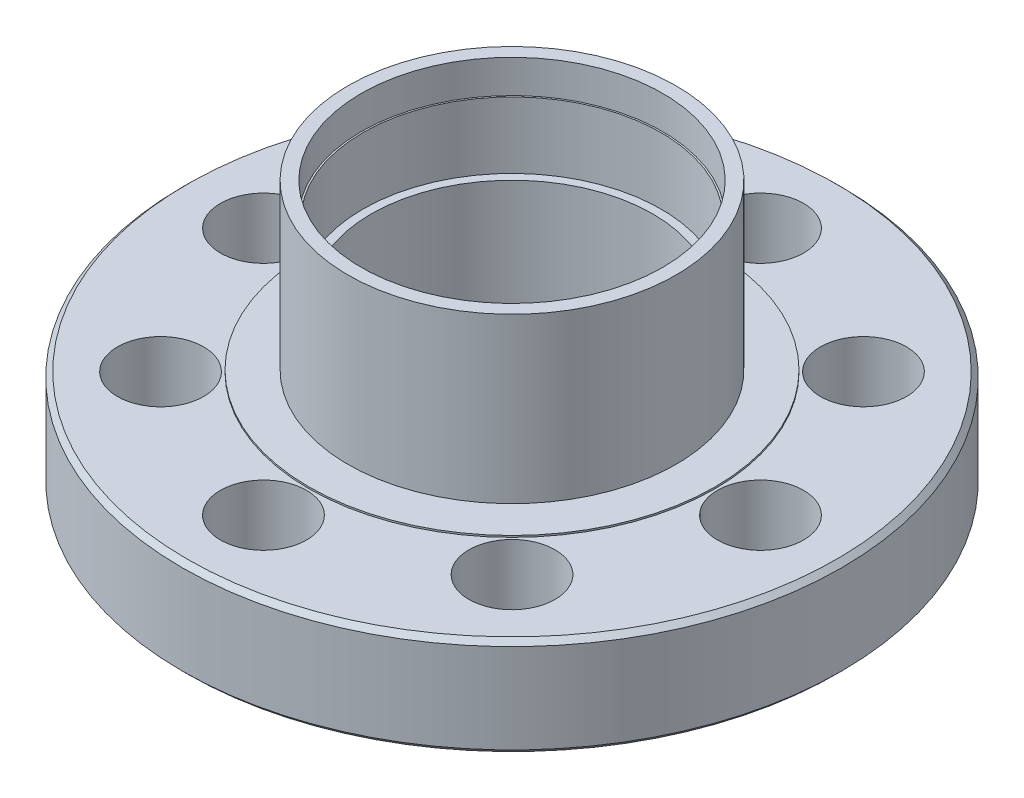
ISO-10303-21;
HEADER;
FILE_DESCRIPTION(('STEP AP214'),'2;1');
FILE_NAME('part.step','',(''),(''),'','','');
FILE_SCHEMA(('AUTOMOTIVE_DESIGN { 1 0 10303 214 1 1 1 1 }'));
ENDSEC;
DATA;
#1=APPLICATION_CONTEXT('core data for automotive mechanical design processes');
#2=APPLICATION_PROTOCOL_DEFINITION('international standard','automotive_design',2000,#1);
#3=PRODUCT_CONTEXT('',#1,'mechanical');
#4=PRODUCT('Part','Part','',(#3));
#5=PRODUCT_RELATED_PRODUCT_CATEGORY('part','',(#4));
#6=PRODUCT_DEFINITION_FORMATION('','',#4);
#7=PRODUCT_DEFINITION_CONTEXT('part definition',#1,'design');
#8=PRODUCT_DEFINITION('design','',#6,#7);
#9=PRODUCT_DEFINITION_SHAPE('','',#8);
#10=(LENGTH_UNIT() NAMED_UNIT(*) SI_UNIT(.MILLI.,.METRE.));
#11=(NAMED_UNIT(*) PLANE_ANGLE_UNIT() SI_UNIT($,.RADIAN.));
#12=(NAMED_UNIT(*) SI_UNIT($,.STERADIAN.) SOLID_ANGLE_UNIT());
#13=UNCERTAINTY_MEASURE_WITH_UNIT(LENGTH_MEASURE(1.E-05),#10,'distance_accuracy_value','');
#14=(GEOMETRIC_REPRESENTATION_CONTEXT(3) GLOBAL_UNCERTAINTY_ASSIGNED_CONTEXT((#13)) GLOBAL_UNIT_ASSIGNED_CONTEXT((#10,
#11,#12)) REPRESENTATION_CONTEXT('',''));
#15=CARTESIAN_POINT('',(0.,0.,0.));
#16=DIRECTION('',(0.,0.,1.));
#17=DIRECTION('',(1.,0.,0.));
#18=AXIS2_PLACEMENT_3D('',#15,#16,#17);
#19=CARTESIAN_POINT('',(0.,0.1499999999606,-1.294671798367E-13));
#20=DIRECTION('',(0.,1.,0.));
#21=DIRECTION('',(0.,0.,-1.));
#22=AXIS2_PLACEMENT_3D('',#19,#20,#21);
#23=CONICAL_SURFACE('',#22,19.74999999996,0.785398163397448);
#24=CARTESIAN_POINT('',(0.,0.3,0.));
#25=DIRECTION('',(0.,1.,0.));
#26=DIRECTION('',(-1.,0.,0.));
#27=AXIS2_PLACEMENT_3D('',#24,#25,#26);
#28=CIRCLE('',#27,19.9);
#29=CARTESIAN_POINT('',(0.,0.300000000000364,19.8999999999996));
#30=VERTEX_POINT('',#29);
#31=CARTESIAN_POINT('',(-19.9,0.3,0.));
#32=VERTEX_POINT('',#31);
#33=EDGE_CURVE('E28',#30,#32,#28,.T.);
#34=ORIENTED_EDGE('',*,*,#33,.F.);
#35=DIRECTION('',(0.,-0.707106781186548,-0.707106781186548));
#36=VECTOR('',#35,1.);
#37=CARTESIAN_POINT('',(0.,0.1499999999606,19.7499999999599));
#38=LINE('',#37,#36);
#39=CARTESIAN_POINT('',(0.,3.04201108747293E-13,19.5999999999996));
#40=VERTEX_POINT('',#39);
#41=EDGE_CURVE('E11',#30,#40,#38,.T.);
#42=ORIENTED_EDGE('',*,*,#41,.T.);
#43=CARTESIAN_POINT('',(0.,0.,-1.294671798367E-13));
#44=DIRECTION('',(0.,1.,0.));
#45=DIRECTION('',(1.,0.,0.));
#46=AXIS2_PLACEMENT_3D('',#43,#44,#45);
#47=CIRCLE('',#46,19.6);
#48=EDGE_CURVE('E160',#40,#40,#47,.T.);
#49=ORIENTED_EDGE('',*,*,#48,.T.);
#50=ORIENTED_EDGE('',*,*,#41,.F.);
#51=CARTESIAN_POINT('',(0.,0.3,0.));
#52=DIRECTION('',(0.,1.,0.));
#53=DIRECTION('',(-1.,0.,0.));
#54=AXIS2_PLACEMENT_3D('',#51,#52,#53);
#55=CIRCLE('',#54,19.9);
#56=EDGE_CURVE('E161',#32,#30,#55,.T.);
#57=ORIENTED_EDGE('',*,*,#56,.F.);
#58=EDGE_LOOP('',(#34,#42,#49,#50,#57));
#59=FACE_BOUND('',#58,.T.);
#60=ADVANCED_FACE('F17',(#59),#23,.T.);
#61=CARTESIAN_POINT('',(0.,-0.8,0.));
#62=DIRECTION('',(0.,1.,0.));
#63=DIRECTION('',(1.,0.,0.));
#64=AXIS2_PLACEMENT_3D('',#61,#62,#63);
#65=CYLINDRICAL_SURFACE('',#64,19.9);
#66=CARTESIAN_POINT('',(0.,5.7,0.));
#67=DIRECTION('',(0.,1.,0.));
#68=DIRECTION('',(1.,0.,0.));
#69=AXIS2_PLACEMENT_3D('',#66,#67,#68);
#70=CIRCLE('',#69,19.9);
#71=CARTESIAN_POINT('',(-19.9,5.7,0.));
#72=VERTEX_POINT('',#71);
#73=CARTESIAN_POINT('',(0.,5.69999999999944,19.8999999999994));
#74=VERTEX_POINT('',#73);
#75=EDGE_CURVE('E206',#72,#74,#70,.T.);
#76=ORIENTED_EDGE('',*,*,#75,.F.);
#77=DIRECTION('',(0.,-1.,0.));
#78=VECTOR('',#77,1.);
#79=CARTESIAN_POINT('',(-19.9,-0.8,0.));
#80=LINE('',#79,#78);
#81=EDGE_CURVE('E165',#72,#32,#80,.T.);
#82=ORIENTED_EDGE('',*,*,#81,.T.);
#83=ORIENTED_EDGE('',*,*,#56,.T.);
#84=ORIENTED_EDGE('',*,*,#33,.T.);
#85=ORIENTED_EDGE('',*,*,#81,.F.);
#86=CARTESIAN_POINT('',(0.,5.7,0.));
#87=DIRECTION('',(0.,1.,0.));
#88=DIRECTION('',(1.,0.,0.));
#89=AXIS2_PLACEMENT_3D('',#86,#87,#88);
#90=CIRCLE('',#89,19.9);
#91=EDGE_CURVE('E237',#74,#72,#90,.T.);
#92=ORIENTED_EDGE('',*,*,#91,.F.);
#93=EDGE_LOOP('',(#76,#82,#83,#84,#85,#92));
#94=FACE_BOUND('',#93,.T.);
#95=ADVANCED_FACE('F344',(#94),#65,.T.);
#96=CARTESIAN_POINT('',(0.,5.850000000069,-1.294671798367E-13));
#97=DIRECTION('',(0.,-1.,0.));
#98=DIRECTION('',(0.,0.,-1.));
#99=AXIS2_PLACEMENT_3D('',#96,#97,#98);
#100=CONICAL_SURFACE('',#99,19.74999999993,0.785398163397448);
#101=ORIENTED_EDGE('',*,*,#75,.T.);
#102=DIRECTION('',(0.,0.707106781186548,-0.707106781186548));
#103=VECTOR('',#102,1.);
#104=CARTESIAN_POINT('',(0.,5.850000000069,19.7499999999299));
#105=LINE('',#104,#103);
#106=CARTESIAN_POINT('',(0.,5.9999999999995,19.5999999999994));
#107=VERTEX_POINT('',#106);
#108=EDGE_CURVE('E210',#74,#107,#105,.T.);
#109=ORIENTED_EDGE('',*,*,#108,.T.);
#110=CARTESIAN_POINT('',(0.,6.,-1.294671798367E-13));
#111=DIRECTION('',(0.,1.,0.));
#112=DIRECTION('',(1.,0.,0.));
#113=AXIS2_PLACEMENT_3D('',#110,#111,#112);
#114=CIRCLE('',#113,19.6);
#115=EDGE_CURVE('E180',#107,#107,#114,.T.);
#116=ORIENTED_EDGE('',*,*,#115,.F.);
#117=ORIENTED_EDGE('',*,*,#108,.F.);
#118=ORIENTED_EDGE('',*,*,#91,.T.);
#119=EDGE_LOOP('',(#101,#109,#116,#117,#118));
#120=FACE_BOUND('',#119,.T.);
#121=ADVANCED_FACE('F349',(#120),#100,.T.);
#122=CARTESIAN_POINT('',(-10.6066017178,6.,10.6066017178));
#123=DIRECTION('',(0.,-1.,0.));
#124=DIRECTION('',(0.707106781186548,0.,0.707106781186548));
#125=AXIS2_PLACEMENT_3D('',#122,#123,#124);
#126=CYLINDRICAL_SURFACE('',#125,2.6);
#127=CARTESIAN_POINT('',(-10.6066017178,6.,10.6066017178));
#128=DIRECTION('',(0.,-1.,0.));
#129=DIRECTION('',(0.707106781186548,0.,0.707106781186548));
#130=AXIS2_PLACEMENT_3D('',#127,#128,#129);
#131=CIRCLE('',#130,2.6);
#132=CARTESIAN_POINT('',(-12.445079348885,6.,8.76812408671498));
#133=VERTEX_POINT('',#132);
#134=EDGE_CURVE('E230',#133,#133,#131,.T.);
#135=ORIENTED_EDGE('',*,*,#134,.F.);
#136=DIRECTION('',(0.,-1.,0.));
#137=VECTOR('',#136,1.);
#138=CARTESIAN_POINT('',(-12.445079348885,6.,8.76812408671498));
#139=LINE('',#138,#137);
#140=CARTESIAN_POINT('',(-12.445079348885,0.,8.76812408671498));
#141=VERTEX_POINT('',#140);
#142=EDGE_CURVE('E211',#133,#141,#139,.T.);
#143=ORIENTED_EDGE('',*,*,#142,.T.);
#144=CARTESIAN_POINT('',(-10.6066017178,0.,10.6066017178));
#145=DIRECTION('',(0.,-1.,0.));
#146=DIRECTION('',(0.707106781186548,0.,0.707106781186548));
#147=AXIS2_PLACEMENT_3D('',#144,#145,#146);
#148=CIRCLE('',#147,2.6);
#149=EDGE_CURVE('E182',#141,#141,#148,.T.);
#150=ORIENTED_EDGE('',*,*,#149,.T.);
#151=ORIENTED_EDGE('',*,*,#142,.F.);
#152=EDGE_LOOP('',(#135,#143,#150,#151));
#153=FACE_BOUND('',#152,.T.);
#154=ADVANCED_FACE('F607',(#153),#126,.F.);
#155=CARTESIAN_POINT('',(-15.,6.,0.));
#156=DIRECTION('',(0.,-1.,0.));
#157=DIRECTION('',(0.,0.,1.));
#158=AXIS2_PLACEMENT_3D('',#155,#156,#157);
#159=CYLINDRICAL_SURFACE('',#158,2.6);
#160=CARTESIAN_POINT('',(-15.,6.,0.));
#161=DIRECTION('',(0.,-1.,0.));
#162=DIRECTION('',(0.,0.,1.));
#163=AXIS2_PLACEMENT_3D('',#160,#161,#162);
#164=CIRCLE('',#163,2.6);
#165=CARTESIAN_POINT('',(-15.,6.,-2.6));
#166=VERTEX_POINT('',#165);
#167=EDGE_CURVE('E234',#166,#166,#164,.T.);
#168=ORIENTED_EDGE('',*,*,#167,.F.);
#169=DIRECTION('',(0.,-1.,0.));
#170=VECTOR('',#169,1.);
#171=CARTESIAN_POINT('',(-15.,6.,-2.6));
#172=LINE('',#171,#170);
#173=CARTESIAN_POINT('',(-15.,0.,-2.6));
#174=VERTEX_POINT('',#173);
#175=EDGE_CURVE('E280',#166,#174,#172,.T.);
#176=ORIENTED_EDGE('',*,*,#175,.T.);
#177=CARTESIAN_POINT('',(-15.,0.,0.));
#178=DIRECTION('',(0.,-1.,0.));
#179=DIRECTION('',(0.,0.,1.));
#180=AXIS2_PLACEMENT_3D('',#177,#178,#179);
#181=CIRCLE('',#180,2.6);
#182=EDGE_CURVE('E187',#174,#174,#181,.T.);
#183=ORIENTED_EDGE('',*,*,#182,.T.);
#184=ORIENTED_EDGE('',*,*,#175,.F.);
#185=EDGE_LOOP('',(#168,#176,#183,#184));
#186=FACE_BOUND('',#185,.T.);
#187=ADVANCED_FACE('F533',(#186),#159,.F.);
#188=CARTESIAN_POINT('',(-10.6066017178,6.,-10.6066017178));
#189=DIRECTION('',(0.,-1.,0.));
#190=DIRECTION('',(-0.707106781186548,0.,0.707106781186548));
#191=AXIS2_PLACEMENT_3D('',#188,#189,#190);
#192=CYLINDRICAL_SURFACE('',#191,2.6);
#193=CARTESIAN_POINT('',(-10.6066017178,6.,-10.6066017178));
#194=DIRECTION('',(0.,-1.,0.));
#195=DIRECTION('',(-0.707106781186548,0.,0.707106781186548));
#196=AXIS2_PLACEMENT_3D('',#193,#194,#195);
#197=CIRCLE('',#196,2.6);
#198=CARTESIAN_POINT('',(-8.76812408671498,6.,-12.445079348885));
#199=VERTEX_POINT('',#198);
#200=EDGE_CURVE('E152',#199,#199,#197,.T.);
#201=ORIENTED_EDGE('',*,*,#200,.F.);
#202=DIRECTION('',(0.,-1.,0.));
#203=VECTOR('',#202,1.);
#204=CARTESIAN_POINT('',(-8.76812408671498,6.,-12.445079348885));
#205=LINE('',#204,#203);
#206=CARTESIAN_POINT('',(-8.76812408671498,0.,-12.445079348885));
#207=VERTEX_POINT('',#206);
#208=EDGE_CURVE('E147',#199,#207,#205,.T.);
#209=ORIENTED_EDGE('',*,*,#208,.T.);
#210=CARTESIAN_POINT('',(-10.6066017178,0.,-10.6066017178));
#211=DIRECTION('',(0.,-1.,0.));
#212=DIRECTION('',(-0.707106781186548,0.,0.707106781186548));
#213=AXIS2_PLACEMENT_3D('',#210,#211,#212);
#214=CIRCLE('',#213,2.6);
#215=EDGE_CURVE('E216',#207,#207,#214,.T.);
#216=ORIENTED_EDGE('',*,*,#215,.T.);
#217=ORIENTED_EDGE('',*,*,#208,.F.);
#218=EDGE_LOOP('',(#201,#209,#216,#217));
#219=FACE_BOUND('',#218,.T.);
#220=ADVANCED_FACE('F528',(#219),#192,.F.);
#221=CARTESIAN_POINT('',(0.,6.,-15.));
#222=DIRECTION('',(0.,-1.,0.));
#223=DIRECTION('',(-1.,0.,0.));
#224=AXIS2_PLACEMENT_3D('',#221,#222,#223);
#225=CYLINDRICAL_SURFACE('',#224,2.6);
#226=CARTESIAN_POINT('',(0.,6.,-15.));
#227=DIRECTION('',(0.,-1.,0.));
#228=DIRECTION('',(-1.,0.,0.));
#229=AXIS2_PLACEMENT_3D('',#226,#227,#228);
#230=CIRCLE('',#229,2.6);
#231=CARTESIAN_POINT('',(2.6,6.,-15.));
#232=VERTEX_POINT('',#231);
#233=EDGE_CURVE('E226',#232,#232,#230,.T.);
#234=ORIENTED_EDGE('',*,*,#233,.F.);
#235=DIRECTION('',(0.,-1.,0.));
#236=VECTOR('',#235,1.);
#237=CARTESIAN_POINT('',(2.6,6.,-15.));
#238=LINE('',#237,#236);
#239=CARTESIAN_POINT('',(2.6,0.,-15.));
#240=VERTEX_POINT('',#239);
#241=EDGE_CURVE('E139',#232,#240,#238,.T.);
#242=ORIENTED_EDGE('',*,*,#241,.T.);
#243=CARTESIAN_POINT('',(0.,0.,-15.));
#244=DIRECTION('',(0.,-1.,0.));
#245=DIRECTION('',(-1.,0.,0.));
#246=AXIS2_PLACEMENT_3D('',#243,#244,#245);
#247=CIRCLE('',#246,2.6);
#248=EDGE_CURVE('E212',#240,#240,#247,.T.);
#249=ORIENTED_EDGE('',*,*,#248,.T.);
#250=ORIENTED_EDGE('',*,*,#241,.F.);
#251=EDGE_LOOP('',(#234,#242,#249,#250));
#252=FACE_BOUND('',#251,.T.);
#253=ADVANCED_FACE('F353',(#252),#225,.F.);
#254=CARTESIAN_POINT('',(10.6066017178,6.,-10.6066017178));
#255=DIRECTION('',(0.,-1.,0.));
#256=DIRECTION('',(-0.707106781186548,0.,-0.707106781186548));
#257=AXIS2_PLACEMENT_3D('',#254,#255,#256);
#258=CYLINDRICAL_SURFACE('',#257,2.6);
#259=CARTESIAN_POINT('',(10.6066017178,6.,-10.6066017178));
#260=DIRECTION('',(0.,-1.,0.));
#261=DIRECTION('',(-0.707106781186548,0.,-0.707106781186548));
#262=AXIS2_PLACEMENT_3D('',#259,#260,#261);
#263=CIRCLE('',#262,2.6);
#264=CARTESIAN_POINT('',(12.445079348885,6.,-8.76812408671498));
#265=VERTEX_POINT('',#264);
#266=EDGE_CURVE('E137',#265,#265,#263,.T.);
#267=ORIENTED_EDGE('',*,*,#266,.F.);
#268=DIRECTION('',(0.,-1.,0.));
#269=VECTOR('',#268,1.);
#270=CARTESIAN_POINT('',(12.445079348885,6.,-8.76812408671498));
#271=LINE('',#270,#269);
#272=CARTESIAN_POINT('',(12.445079348885,0.,-8.76812408671498));
#273=VERTEX_POINT('',#272);
#274=EDGE_CURVE('E132',#265,#273,#271,.T.);
#275=ORIENTED_EDGE('',*,*,#274,.T.);
#276=CARTESIAN_POINT('',(10.6066017178,0.,-10.6066017178));
#277=DIRECTION('',(0.,-1.,0.));
#278=DIRECTION('',(-0.707106781186548,0.,-0.707106781186548));
#279=AXIS2_PLACEMENT_3D('',#276,#277,#278);
#280=CIRCLE('',#279,2.6);
#281=EDGE_CURVE('E135',#273,#273,#280,.T.);
#282=ORIENTED_EDGE('',*,*,#281,.T.);
#283=ORIENTED_EDGE('',*,*,#274,.F.);
#284=EDGE_LOOP('',(#267,#275,#282,#283));
#285=FACE_BOUND('',#284,.T.);
#286=ADVANCED_FACE('F133',(#285),#258,.F.);
#287=CARTESIAN_POINT('',(15.,6.,0.));
#288=DIRECTION('',(0.,-1.,0.));
#289=DIRECTION('',(0.,0.,-1.));
#290=AXIS2_PLACEMENT_3D('',#287,#288,#289);
#291=CYLINDRICAL_SURFACE('',#290,2.6);
#292=CARTESIAN_POINT('',(15.,6.,0.));
#293=DIRECTION('',(0.,-1.,0.));
#294=DIRECTION('',(0.,0.,-1.));
#295=AXIS2_PLACEMENT_3D('',#292,#293,#294);
#296=CIRCLE('',#295,2.6);
#297=CARTESIAN_POINT('',(15.,6.,2.6));
#298=VERTEX_POINT('',#297);
#299=EDGE_CURVE('E264',#298,#298,#296,.T.);
#300=ORIENTED_EDGE('',*,*,#299,.F.);
#301=DIRECTION('',(0.,-1.,0.));
#302=VECTOR('',#301,1.);
#303=CARTESIAN_POINT('',(15.,6.,2.6));
#304=LINE('',#303,#302);
#305=CARTESIAN_POINT('',(15.,0.,2.6));
#306=VERTEX_POINT('',#305);
#307=EDGE_CURVE('E140',#298,#306,#304,.T.);
#308=ORIENTED_EDGE('',*,*,#307,.T.);
#309=CARTESIAN_POINT('',(15.,0.,0.));
#310=DIRECTION('',(0.,-1.,0.));
#311=DIRECTION('',(0.,0.,-1.));
#312=AXIS2_PLACEMENT_3D('',#309,#310,#311);
#313=CIRCLE('',#312,2.6);
#314=EDGE_CURVE('E159',#306,#306,#313,.T.);
#315=ORIENTED_EDGE('',*,*,#314,.T.);
#316=ORIENTED_EDGE('',*,*,#307,.F.);
#317=EDGE_LOOP('',(#300,#308,#315,#316));
#318=FACE_BOUND('',#317,.T.);
#319=ADVANCED_FACE('F357',(#318),#291,.F.);
#320=CARTESIAN_POINT('',(10.6066017178,6.,10.6066017178));
#321=DIRECTION('',(0.,-1.,0.));
#322=DIRECTION('',(0.707106781186548,0.,-0.707106781186548));
#323=AXIS2_PLACEMENT_3D('',#320,#321,#322);
#324=CYLINDRICAL_SURFACE('',#323,2.6);
#325=CARTESIAN_POINT('',(10.6066017178,6.,10.6066017178));
#326=DIRECTION('',(0.,-1.,0.));
#327=DIRECTION('',(0.707106781186548,0.,-0.707106781186548));
#328=AXIS2_PLACEMENT_3D('',#325,#326,#327);
#329=CIRCLE('',#328,2.6);
#330=CARTESIAN_POINT('',(8.76812408671498,6.,12.445079348885));
#331=VERTEX_POINT('',#330);
#332=EDGE_CURVE('E267',#331,#331,#329,.T.);
#333=ORIENTED_EDGE('',*,*,#332,.F.);
#334=DIRECTION('',(0.,-1.,0.));
#335=VECTOR('',#334,1.);
#336=CARTESIAN_POINT('',(8.76812408671498,6.,12.445079348885));
#337=LINE('',#336,#335);
#338=CARTESIAN_POINT('',(8.76812408671498,0.,12.445079348885));
#339=VERTEX_POINT('',#338);
#340=EDGE_CURVE('E149',#331,#339,#337,.T.);
#341=ORIENTED_EDGE('',*,*,#340,.T.);
#342=CARTESIAN_POINT('',(10.6066017178,0.,10.6066017178));
#343=DIRECTION('',(0.,-1.,0.));
#344=DIRECTION('',(0.707106781186548,0.,-0.707106781186548));
#345=AXIS2_PLACEMENT_3D('',#342,#343,#344);
#346=CIRCLE('',#345,2.6);
#347=EDGE_CURVE('E155',#339,#339,#346,.T.);
#348=ORIENTED_EDGE('',*,*,#347,.T.);
#349=ORIENTED_EDGE('',*,*,#340,.F.);
#350=EDGE_LOOP('',(#333,#341,#348,#349));
#351=FACE_BOUND('',#350,.T.);
#352=ADVANCED_FACE('F358',(#351),#324,.F.);
#353=CARTESIAN_POINT('',(0.,0.1500000005207,0.));
#354=DIRECTION('',(0.,-1.,0.));
#355=DIRECTION('',(0.,0.,-1.));
#356=AXIS2_PLACEMENT_3D('',#353,#354,#355);
#357=CONICAL_SURFACE('',#356,8.649999999479,0.785398163397448);
#358=CARTESIAN_POINT('',(0.,0.3,0.));
#359=DIRECTION('',(0.,1.,0.));
#360=DIRECTION('',(-1.,0.,0.));
#361=AXIS2_PLACEMENT_3D('',#358,#359,#360);
#362=CIRCLE('',#361,8.5);
#363=CARTESIAN_POINT('',(0.,0.299999999999851,8.49999999999985));
#364=VERTEX_POINT('',#363);
#365=CARTESIAN_POINT('',(-8.5,0.3,0.));
#366=VERTEX_POINT('',#365);
#367=EDGE_CURVE('E221',#364,#366,#362,.T.);
#368=ORIENTED_EDGE('',*,*,#367,.T.);
#369=CARTESIAN_POINT('',(0.,0.3,0.));
#370=DIRECTION('',(0.,1.,0.));
#371=DIRECTION('',(-1.,0.,0.));
#372=AXIS2_PLACEMENT_3D('',#369,#370,#371);
#373=CIRCLE('',#372,8.5);
#374=EDGE_CURVE('E21',#366,#364,#373,.T.);
#375=ORIENTED_EDGE('',*,*,#374,.T.);
#376=DIRECTION('',(0.,-0.707106781186548,0.707106781186548));
#377=VECTOR('',#376,1.);
#378=CARTESIAN_POINT('',(0.,0.1500000005207,8.649999999479));
#379=LINE('',#378,#377);
#380=CARTESIAN_POINT('',(0.,-1.63584423784613E-13,8.79999999999986));
#381=VERTEX_POINT('',#380);
#382=EDGE_CURVE('E172',#364,#381,#379,.T.);
#383=ORIENTED_EDGE('',*,*,#382,.T.);
#384=CARTESIAN_POINT('',(0.,0.,0.));
#385=DIRECTION('',(0.,1.,0.));
#386=DIRECTION('',(1.,0.,0.));
#387=AXIS2_PLACEMENT_3D('',#384,#385,#386);
#388=CIRCLE('',#387,8.8);
#389=EDGE_CURVE('E252',#381,#381,#388,.T.);
#390=ORIENTED_EDGE('',*,*,#389,.F.);
#391=ORIENTED_EDGE('',*,*,#382,.F.);
#392=EDGE_LOOP('',(#368,#375,#383,#390,#391));
#393=FACE_BOUND('',#392,.T.);
#394=ADVANCED_FACE('F360',(#393),#357,.F.);
#395=CARTESIAN_POINT('',(0.,-0.8,0.));
#396=DIRECTION('',(0.,1.,0.));
#397=DIRECTION('',(1.,0.,0.));
#398=AXIS2_PLACEMENT_3D('',#395,#396,#397);
#399=CYLINDRICAL_SURFACE('',#398,8.5);
#400=ORIENTED_EDGE('',*,*,#367,.F.);
#401=ORIENTED_EDGE('',*,*,#374,.F.);
#402=DIRECTION('',(0.,1.,0.));
#403=VECTOR('',#402,1.);
#404=CARTESIAN_POINT('',(-8.5,-0.8,0.));
#405=LINE('',#404,#403);
#406=CARTESIAN_POINT('',(-8.5,10.,0.));
#407=VERTEX_POINT('',#406);
#408=EDGE_CURVE('E176',#366,#407,#405,.T.);
#409=ORIENTED_EDGE('',*,*,#408,.T.);
#410=CARTESIAN_POINT('',(0.,10.,0.));
#411=DIRECTION('',(0.,-1.,0.));
#412=DIRECTION('',(1.,0.,0.));
#413=AXIS2_PLACEMENT_3D('',#410,#411,#412);
#414=CIRCLE('',#413,8.5);
#415=EDGE_CURVE('E225',#407,#407,#414,.T.);
#416=ORIENTED_EDGE('',*,*,#415,.F.);
#417=ORIENTED_EDGE('',*,*,#408,.F.);
#418=EDGE_LOOP('',(#400,#401,#409,#416,#417));
#419=FACE_BOUND('',#418,.T.);
#420=ADVANCED_FACE('F366',(#419),#399,.F.);
#421=CARTESIAN_POINT('',(0.,10.,0.));
#422=DIRECTION('',(0.,1.,0.));
#423=DIRECTION('',(1.,0.,0.));
#424=AXIS2_PLACEMENT_3D('',#421,#422,#423);
#425=PLANE('',#424);
#426=ORIENTED_EDGE('',*,*,#415,.T.);
#427=EDGE_LOOP('',(#426));
#428=FACE_BOUND('',#427,.T.);
#429=CARTESIAN_POINT('',(0.,10.,0.));
#430=DIRECTION('',(0.,-1.,0.));
#431=DIRECTION('',(1.,0.,0.));
#432=AXIS2_PLACEMENT_3D('',#429,#430,#431);
#433=CIRCLE('',#432,9.);
#434=CARTESIAN_POINT('',(-9.,10.,0.));
#435=VERTEX_POINT('',#434);
#436=EDGE_CURVE('E200',#435,#435,#433,.T.);
#437=ORIENTED_EDGE('',*,*,#436,.F.);
#438=EDGE_LOOP('',(#437));
#439=FACE_BOUND('',#438,.T.);
#440=ADVANCED_FACE('F551',(#428,#439),#425,.T.);
#441=CARTESIAN_POINT('',(0.,-0.8,0.));
#442=DIRECTION('',(0.,1.,0.));
#443=DIRECTION('',(1.,0.,0.));
#444=AXIS2_PLACEMENT_3D('',#441,#442,#443);
#445=CYLINDRICAL_SURFACE('',#444,9.);
#446=ORIENTED_EDGE('',*,*,#436,.T.);
#447=DIRECTION('',(0.,1.,0.));
#448=VECTOR('',#447,1.);
#449=CARTESIAN_POINT('',(-9.,-0.8,0.));
#450=LINE('',#449,#448);
#451=CARTESIAN_POINT('',(-9.,14.,0.));
#452=VERTEX_POINT('',#451);
#453=EDGE_CURVE('E204',#435,#452,#450,.T.);
#454=ORIENTED_EDGE('',*,*,#453,.T.);
#455=CARTESIAN_POINT('',(0.,14.,0.));
#456=DIRECTION('',(0.,-1.,0.));
#457=DIRECTION('',(1.,0.,0.));
#458=AXIS2_PLACEMENT_3D('',#455,#456,#457);
#459=CIRCLE('',#458,9.);
#460=EDGE_CURVE('E205',#452,#452,#459,.T.);
#461=ORIENTED_EDGE('',*,*,#460,.F.);
#462=ORIENTED_EDGE('',*,*,#453,.F.);
#463=EDGE_LOOP('',(#446,#454,#461,#462));
#464=FACE_BOUND('',#463,.T.);
#465=ADVANCED_FACE('F595',(#464),#445,.F.);
#466=CARTESIAN_POINT('',(0.,14.,0.));
#467=DIRECTION('',(0.,1.,0.));
#468=DIRECTION('',(1.,0.,0.));
#469=AXIS2_PLACEMENT_3D('',#466,#467,#468);
#470=PLANE('',#469);
#471=ORIENTED_EDGE('',*,*,#460,.T.);
#472=EDGE_LOOP('',(#471));
#473=FACE_BOUND('',#472,.T.);
#474=CARTESIAN_POINT('',(0.,14.,0.));
#475=DIRECTION('',(0.,-1.,0.));
#476=DIRECTION('',(1.,0.,0.));
#477=AXIS2_PLACEMENT_3D('',#474,#475,#476);
#478=CIRCLE('',#477,9.1);
#479=CARTESIAN_POINT('',(-9.1,14.,0.));
#480=VERTEX_POINT('',#479);
#481=EDGE_CURVE('E220',#480,#480,#478,.T.);
#482=ORIENTED_EDGE('',*,*,#481,.F.);
#483=EDGE_LOOP('',(#482));
#484=FACE_BOUND('',#483,.T.);
#485=ADVANCED_FACE('F338',(#473,#484),#470,.T.);
#486=CARTESIAN_POINT('',(0.,-0.8,0.));
#487=DIRECTION('',(0.,1.,0.));
#488=DIRECTION('',(1.,0.,0.));
#489=AXIS2_PLACEMENT_3D('',#486,#487,#488);
#490=CYLINDRICAL_SURFACE('',#489,9.1);
#491=ORIENTED_EDGE('',*,*,#481,.T.);
#492=DIRECTION('',(0.,1.,0.));
#493=VECTOR('',#492,1.);
#494=CARTESIAN_POINT('',(-9.1,-0.8,0.));
#495=LINE('',#494,#493);
#496=CARTESIAN_POINT('',(-9.1,16.,0.));
#497=VERTEX_POINT('',#496);
#498=EDGE_CURVE('E217',#480,#497,#495,.T.);
#499=ORIENTED_EDGE('',*,*,#498,.T.);
#500=CARTESIAN_POINT('',(0.,16.,0.));
#501=DIRECTION('',(0.,-1.,0.));
#502=DIRECTION('',(1.,0.,0.));
#503=AXIS2_PLACEMENT_3D('',#500,#501,#502);
#504=CIRCLE('',#503,9.1);
#505=EDGE_CURVE('E199',#497,#497,#504,.T.);
#506=ORIENTED_EDGE('',*,*,#505,.F.);
#507=ORIENTED_EDGE('',*,*,#498,.F.);
#508=EDGE_LOOP('',(#491,#499,#506,#507));
#509=FACE_BOUND('',#508,.T.);
#510=ADVANCED_FACE('F328',(#509),#490,.F.);
#511=CARTESIAN_POINT('',(0.,16.,0.));
#512=DIRECTION('',(0.,1.,0.));
#513=DIRECTION('',(1.,0.,0.));
#514=AXIS2_PLACEMENT_3D('',#511,#512,#513);
#515=PLANE('',#514);
#516=ORIENTED_EDGE('',*,*,#505,.T.);
#517=EDGE_LOOP('',(#516));
#518=FACE_BOUND('',#517,.T.);
#519=CARTESIAN_POINT('',(0.,16.,0.));
#520=DIRECTION('',(0.,-1.,0.));
#521=DIRECTION('',(1.,0.,0.));
#522=AXIS2_PLACEMENT_3D('',#519,#520,#521);
#523=CIRCLE('',#522,9.9);
#524=CARTESIAN_POINT('',(-9.9,16.,0.));
#525=VERTEX_POINT('',#524);
#526=EDGE_CURVE('E170',#525,#525,#523,.T.);
#527=ORIENTED_EDGE('',*,*,#526,.F.);
#528=EDGE_LOOP('',(#527));
#529=FACE_BOUND('',#528,.T.);
#530=ADVANCED_FACE('F326',(#518,#529),#515,.T.);
#531=CARTESIAN_POINT('',(0.,-0.8,0.));
#532=DIRECTION('',(0.,1.,0.));
#533=DIRECTION('',(1.,0.,0.));
#534=AXIS2_PLACEMENT_3D('',#531,#532,#533);
#535=CYLINDRICAL_SURFACE('',#534,9.9);
#536=ORIENTED_EDGE('',*,*,#526,.T.);
#537=DIRECTION('',(0.,-1.,0.));
#538=VECTOR('',#537,1.);
#539=CARTESIAN_POINT('',(-9.9,-0.8,0.));
#540=LINE('',#539,#538);
#541=CARTESIAN_POINT('',(-9.9,6.1,0.));
#542=VERTEX_POINT('',#541);
#543=EDGE_CURVE('E195',#525,#542,#540,.T.);
#544=ORIENTED_EDGE('',*,*,#543,.T.);
#545=CARTESIAN_POINT('',(0.,6.1,0.));
#546=DIRECTION('',(0.,-1.,0.));
#547=DIRECTION('',(1.,0.,0.));
#548=AXIS2_PLACEMENT_3D('',#545,#546,#547);
#549=CIRCLE('',#548,9.9);
#550=EDGE_CURVE('E166',#542,#542,#549,.T.);
#551=ORIENTED_EDGE('',*,*,#550,.F.);
#552=ORIENTED_EDGE('',*,*,#543,.F.);
#553=EDGE_LOOP('',(#536,#544,#551,#552));
#554=FACE_BOUND('',#553,.T.);
#555=ADVANCED_FACE('F320',(#554),#535,.T.);
#556=CARTESIAN_POINT('',(0.,6.1,0.));
#557=DIRECTION('',(0.,1.,0.));
#558=DIRECTION('',(1.,0.,0.));
#559=AXIS2_PLACEMENT_3D('',#556,#557,#558);
#560=PLANE('',#559);
#561=ORIENTED_EDGE('',*,*,#550,.T.);
#562=EDGE_LOOP('',(#561));
#563=FACE_BOUND('',#562,.T.);
#564=CARTESIAN_POINT('',(0.,6.1,0.));
#565=DIRECTION('',(0.,-1.,0.));
#566=DIRECTION('',(1.,0.,0.));
#567=AXIS2_PLACEMENT_3D('',#564,#565,#566);
#568=CIRCLE('',#567,12.25);
#569=CARTESIAN_POINT('',(-12.25,6.1,0.));
#570=VERTEX_POINT('',#569);
#571=EDGE_CURVE('E190',#570,#570,#568,.T.);
#572=ORIENTED_EDGE('',*,*,#571,.F.);
#573=EDGE_LOOP('',(#572));
#574=FACE_BOUND('',#573,.T.);
#575=ADVANCED_FACE('F336',(#563,#574),#560,.T.);
#576=CARTESIAN_POINT('',(0.,-0.8,0.));
#577=DIRECTION('',(0.,1.,0.));
#578=DIRECTION('',(1.,0.,0.));
#579=AXIS2_PLACEMENT_3D('',#576,#577,#578);
#580=CYLINDRICAL_SURFACE('',#579,12.25);
#581=ORIENTED_EDGE('',*,*,#571,.T.);
#582=DIRECTION('',(0.,-1.,0.));
#583=VECTOR('',#582,1.);
#584=CARTESIAN_POINT('',(-12.25,-0.8,0.));
#585=LINE('',#584,#583);
#586=CARTESIAN_POINT('',(-12.25,6.,0.));
#587=VERTEX_POINT('',#586);
#588=EDGE_CURVE('E171',#570,#587,#585,.T.);
#589=ORIENTED_EDGE('',*,*,#588,.T.);
#590=CARTESIAN_POINT('',(0.,6.,0.));
#591=DIRECTION('',(0.,-1.,0.));
#592=DIRECTION('',(1.,0.,0.));
#593=AXIS2_PLACEMENT_3D('',#590,#591,#592);
#594=CIRCLE('',#593,12.25);
#595=EDGE_CURVE('E194',#587,#587,#594,.T.);
#596=ORIENTED_EDGE('',*,*,#595,.F.);
#597=ORIENTED_EDGE('',*,*,#588,.F.);
#598=EDGE_LOOP('',(#581,#589,#596,#597));
#599=FACE_BOUND('',#598,.T.);
#600=ADVANCED_FACE('F590',(#599),#580,.T.);
#601=CARTESIAN_POINT('',(0.,6.,0.));
#602=DIRECTION('',(0.,1.,0.));
#603=DIRECTION('',(1.,0.,0.));
#604=AXIS2_PLACEMENT_3D('',#601,#602,#603);
#605=PLANE('',#604);
#606=ORIENTED_EDGE('',*,*,#595,.T.);
#607=EDGE_LOOP('',(#606));
#608=FACE_BOUND('',#607,.T.);
#609=ORIENTED_EDGE('',*,*,#134,.T.);
#610=EDGE_LOOP('',(#609));
#611=FACE_BOUND('',#610,.T.);
#612=ORIENTED_EDGE('',*,*,#167,.T.);
#613=EDGE_LOOP('',(#612));
#614=FACE_BOUND('',#613,.T.);
#615=ORIENTED_EDGE('',*,*,#200,.T.);
#616=EDGE_LOOP('',(#615));
#617=FACE_BOUND('',#616,.T.);
#618=ORIENTED_EDGE('',*,*,#233,.T.);
#619=EDGE_LOOP('',(#618));
#620=FACE_BOUND('',#619,.T.);
#621=ORIENTED_EDGE('',*,*,#266,.T.);
#622=EDGE_LOOP('',(#621));
#623=FACE_BOUND('',#622,.T.);
#624=ORIENTED_EDGE('',*,*,#299,.T.);
#625=EDGE_LOOP('',(#624));
#626=FACE_BOUND('',#625,.T.);
#627=ORIENTED_EDGE('',*,*,#332,.T.);
#628=EDGE_LOOP('',(#627));
#629=FACE_BOUND('',#628,.T.);
#630=CARTESIAN_POINT('',(0.,6.,15.));
#631=DIRECTION('',(0.,-1.,0.));
#632=DIRECTION('',(1.,0.,0.));
#633=AXIS2_PLACEMENT_3D('',#630,#631,#632);
#634=CIRCLE('',#633,2.6);
#635=CARTESIAN_POINT('',(-2.6,6.,15.));
#636=VERTEX_POINT('',#635);
#637=EDGE_CURVE('E181',#636,#636,#634,.T.);
#638=ORIENTED_EDGE('',*,*,#637,.T.);
#639=EDGE_LOOP('',(#638));
#640=FACE_BOUND('',#639,.T.);
#641=ORIENTED_EDGE('',*,*,#115,.T.);
#642=EDGE_LOOP('',(#641));
#643=FACE_BOUND('',#642,.T.);
#644=ADVANCED_FACE('F616',(#608,#611,#614,#617,#620,#623,#626,#629,#640,#643),#605,.T.);
#645=CARTESIAN_POINT('',(0.,6.,15.));
#646=DIRECTION('',(0.,-1.,0.));
#647=DIRECTION('',(1.,0.,0.));
#648=AXIS2_PLACEMENT_3D('',#645,#646,#647);
#649=CYLINDRICAL_SURFACE('',#648,2.6);
#650=ORIENTED_EDGE('',*,*,#637,.F.);
#651=DIRECTION('',(0.,-1.,0.));
#652=VECTOR('',#651,1.);
#653=CARTESIAN_POINT('',(-2.6,6.,15.));
#654=LINE('',#653,#652);
#655=CARTESIAN_POINT('',(-2.6,0.,15.));
#656=VERTEX_POINT('',#655);
#657=EDGE_CURVE('E177',#636,#656,#654,.T.);
#658=ORIENTED_EDGE('',*,*,#657,.T.);
#659=CARTESIAN_POINT('',(0.,0.,15.));
#660=DIRECTION('',(0.,-1.,0.));
#661=DIRECTION('',(1.,0.,0.));
#662=AXIS2_PLACEMENT_3D('',#659,#660,#661);
#663=CIRCLE('',#662,2.6);
#664=EDGE_CURVE('E186',#656,#656,#663,.T.);
#665=ORIENTED_EDGE('',*,*,#664,.T.);
#666=ORIENTED_EDGE('',*,*,#657,.F.);
#667=EDGE_LOOP('',(#650,#658,#665,#666));
#668=FACE_BOUND('',#667,.T.);
#669=ADVANCED_FACE('F626',(#668),#649,.F.);
#670=CARTESIAN_POINT('',(0.,0.,0.));
#671=DIRECTION('',(0.,1.,0.));
#672=DIRECTION('',(1.,0.,0.));
#673=AXIS2_PLACEMENT_3D('',#670,#671,#672);
#674=PLANE('',#673);
#675=ORIENTED_EDGE('',*,*,#389,.T.);
#676=EDGE_LOOP('',(#675));
#677=FACE_BOUND('',#676,.T.);
#678=ORIENTED_EDGE('',*,*,#664,.F.);
#679=EDGE_LOOP('',(#678));
#680=FACE_BOUND('',#679,.T.);
#681=ORIENTED_EDGE('',*,*,#149,.F.);
#682=EDGE_LOOP('',(#681));
#683=FACE_BOUND('',#682,.T.);
#684=ORIENTED_EDGE('',*,*,#182,.F.);
#685=EDGE_LOOP('',(#684));
#686=FACE_BOUND('',#685,.T.);
#687=ORIENTED_EDGE('',*,*,#215,.F.);
#688=EDGE_LOOP('',(#687));
#689=FACE_BOUND('',#688,.T.);
#690=ORIENTED_EDGE('',*,*,#248,.F.);
#691=EDGE_LOOP('',(#690));
#692=FACE_BOUND('',#691,.T.);
#693=ORIENTED_EDGE('',*,*,#281,.F.);
#694=EDGE_LOOP('',(#693));
#695=FACE_BOUND('',#694,.T.);
#696=ORIENTED_EDGE('',*,*,#314,.F.);
#697=EDGE_LOOP('',(#696));
#698=FACE_BOUND('',#697,.T.);
#699=ORIENTED_EDGE('',*,*,#347,.F.);
#700=EDGE_LOOP('',(#699));
#701=FACE_BOUND('',#700,.T.);
#702=ORIENTED_EDGE('',*,*,#48,.F.);
#703=EDGE_LOOP('',(#702));
#704=FACE_BOUND('',#703,.T.);
#705=ADVANCED_FACE('F19',(#677,#680,#683,#686,#689,#692,#695,#698,#701,#704),#674,.F.);
#706=CLOSED_SHELL('',(#60,#95,#121,#154,#187,#220,#253,#286,#319,#352,#394,#420,#440,#465,#485,
#510,#530,#555,#575,#600,#644,#669,#705));
#707=MANIFOLD_SOLID_BREP('B1',#706);
#708=ADVANCED_BREP_SHAPE_REPRESENTATION('',(#18,#707),#14);
#709=SHAPE_DEFINITION_REPRESENTATION(#9,#708);
ENDSEC;
END-ISO-10303-21;
